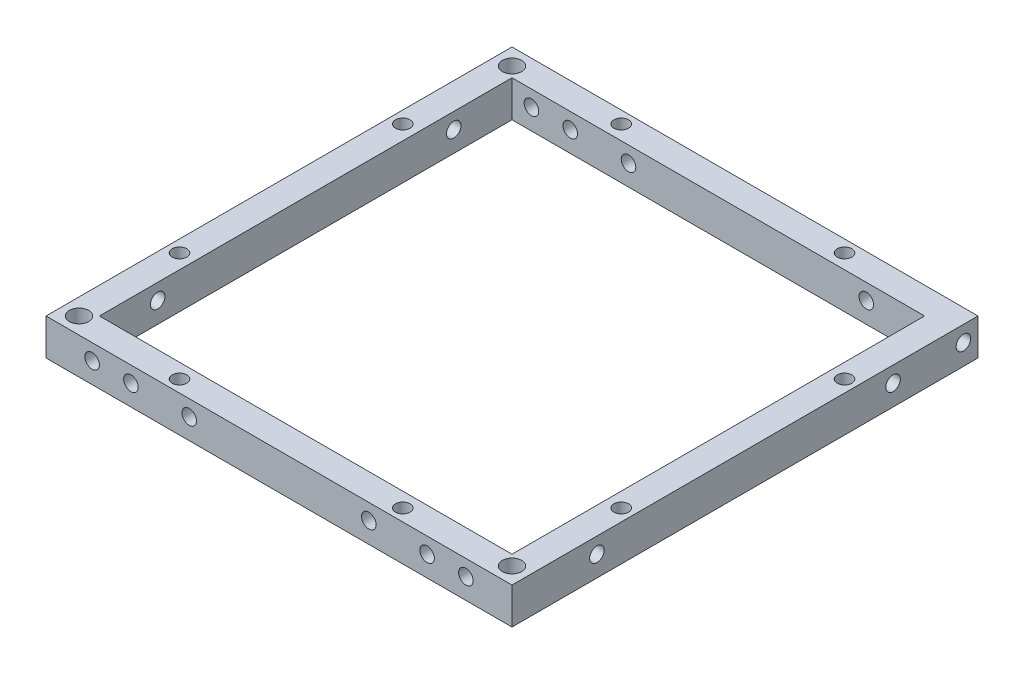
ISO-10303-21;
HEADER;
FILE_DESCRIPTION(('STEP AP214'),'2;1');
FILE_NAME('part.step','',(''),(''),'','','');
FILE_SCHEMA(('AUTOMOTIVE_DESIGN { 1 0 10303 214 1 1 1 1 }'));
ENDSEC;
DATA;
#1=APPLICATION_CONTEXT('core data for automotive mechanical design processes');
#2=APPLICATION_PROTOCOL_DEFINITION('international standard','automotive_design',2000,#1);
#3=PRODUCT_CONTEXT('',#1,'mechanical');
#4=PRODUCT('Part','Part','',(#3));
#5=PRODUCT_RELATED_PRODUCT_CATEGORY('part','',(#4));
#6=PRODUCT_DEFINITION_FORMATION('','',#4);
#7=PRODUCT_DEFINITION_CONTEXT('part definition',#1,'design');
#8=PRODUCT_DEFINITION('design','',#6,#7);
#9=PRODUCT_DEFINITION_SHAPE('','',#8);
#10=(LENGTH_UNIT() NAMED_UNIT(*) SI_UNIT(.MILLI.,.METRE.));
#11=(NAMED_UNIT(*) PLANE_ANGLE_UNIT() SI_UNIT($,.RADIAN.));
#12=(NAMED_UNIT(*) SI_UNIT($,.STERADIAN.) SOLID_ANGLE_UNIT());
#13=UNCERTAINTY_MEASURE_WITH_UNIT(LENGTH_MEASURE(1.E-05),#10,'distance_accuracy_value','');
#14=(GEOMETRIC_REPRESENTATION_CONTEXT(3) GLOBAL_UNCERTAINTY_ASSIGNED_CONTEXT((#13)) GLOBAL_UNIT_ASSIGNED_CONTEXT((#10,
#11,#12)) REPRESENTATION_CONTEXT('',''));
#15=CARTESIAN_POINT('',(0.,0.,0.));
#16=DIRECTION('',(0.,0.,1.));
#17=DIRECTION('',(1.,0.,0.));
#18=AXIS2_PLACEMENT_3D('',#15,#16,#17);
#19=CARTESIAN_POINT('',(0.,6.5,0.));
#20=DIRECTION('',(0.,1.,0.));
#21=DIRECTION('',(0.,0.,1.));
#22=AXIS2_PLACEMENT_3D('',#19,#20,#21);
#23=PLANE('',#22);
#24=DIRECTION('',(1.,0.,0.));
#25=VECTOR('',#24,1.);
#26=CARTESIAN_POINT('',(-98.,6.5,48.));
#27=LINE('',#26,#25);
#28=CARTESIAN_POINT('',(-48.,6.5,48.));
#29=VERTEX_POINT('',#28);
#30=CARTESIAN_POINT('',(48.,6.5,48.));
#31=VERTEX_POINT('',#30);
#32=EDGE_CURVE('E79',#29,#31,#27,.T.);
#33=ORIENTED_EDGE('',*,*,#32,.T.);
#34=DIRECTION('',(0.,0.,-1.));
#35=VECTOR('',#34,1.);
#36=CARTESIAN_POINT('',(48.,6.5,48.));
#37=LINE('',#36,#35);
#38=CARTESIAN_POINT('',(48.,6.5,-48.));
#39=VERTEX_POINT('',#38);
#40=EDGE_CURVE('E261',#31,#39,#37,.T.);
#41=ORIENTED_EDGE('',*,*,#40,.T.);
#42=DIRECTION('',(1.,0.,0.));
#43=VECTOR('',#42,1.);
#44=CARTESIAN_POINT('',(-98.,6.5,-48.));
#45=LINE('',#44,#43);
#46=CARTESIAN_POINT('',(-48.,6.5,-48.));
#47=VERTEX_POINT('',#46);
#48=EDGE_CURVE('E235',#47,#39,#45,.T.);
#49=ORIENTED_EDGE('',*,*,#48,.F.);
#50=DIRECTION('',(0.,0.,-1.));
#51=VECTOR('',#50,1.);
#52=CARTESIAN_POINT('',(-48.,6.5,48.));
#53=LINE('',#52,#51);
#54=EDGE_CURVE('E71',#29,#47,#53,.T.);
#55=ORIENTED_EDGE('',*,*,#54,.F.);
#56=EDGE_LOOP('',(#33,#41,#49,#55));
#57=FACE_BOUND('',#56,.T.);
#58=CARTESIAN_POINT('',(-45.4999999999994,6.5,-22.9999999999997));
#59=DIRECTION('',(0.,-1.,0.));
#60=DIRECTION('',(0.,0.,-1.));
#61=AXIS2_PLACEMENT_3D('',#58,#59,#60);
#62=CIRCLE('',#61,1.5);
#63=CARTESIAN_POINT('',(-45.4999999999994,6.5,-24.4999999999997));
#64=VERTEX_POINT('',#63);
#65=EDGE_CURVE('E264',#64,#64,#62,.F.);
#66=ORIENTED_EDGE('',*,*,#65,.F.);
#67=EDGE_LOOP('',(#66));
#68=FACE_BOUND('',#67,.T.);
#69=CARTESIAN_POINT('',(23.0000000000005,6.5,-45.5));
#70=DIRECTION('',(0.,-1.,0.));
#71=DIRECTION('',(0.,0.,-1.));
#72=AXIS2_PLACEMENT_3D('',#69,#70,#71);
#73=CIRCLE('',#72,1.5);
#74=CARTESIAN_POINT('',(23.0000000000005,6.5,-47.));
#75=VERTEX_POINT('',#74);
#76=EDGE_CURVE('E270',#75,#75,#73,.F.);
#77=ORIENTED_EDGE('',*,*,#76,.F.);
#78=EDGE_LOOP('',(#77));
#79=FACE_BOUND('',#78,.T.);
#80=CARTESIAN_POINT('',(45.5000000000008,6.5,22.9999999999999));
#81=DIRECTION('',(0.,-1.,0.));
#82=DIRECTION('',(0.,0.,-1.));
#83=AXIS2_PLACEMENT_3D('',#80,#81,#82);
#84=CIRCLE('',#83,1.5);
#85=CARTESIAN_POINT('',(45.5000000000008,6.5,21.4999999999999));
#86=VERTEX_POINT('',#85);
#87=EDGE_CURVE('E276',#86,#86,#84,.F.);
#88=ORIENTED_EDGE('',*,*,#87,.F.);
#89=EDGE_LOOP('',(#88));
#90=FACE_BOUND('',#89,.T.);
#91=CARTESIAN_POINT('',(-22.9999999999991,6.5,45.5000000000002));
#92=DIRECTION('',(0.,-1.,0.));
#93=DIRECTION('',(0.,0.,-1.));
#94=AXIS2_PLACEMENT_3D('',#91,#92,#93);
#95=CIRCLE('',#94,1.5);
#96=CARTESIAN_POINT('',(-22.9999999999991,6.5,44.0000000000002));
#97=VERTEX_POINT('',#96);
#98=EDGE_CURVE('E254',#97,#97,#95,.F.);
#99=ORIENTED_EDGE('',*,*,#98,.F.);
#100=EDGE_LOOP('',(#99));
#101=FACE_BOUND('',#100,.T.);
#102=CARTESIAN_POINT('',(23.0000000000009,6.5,45.5));
#103=DIRECTION('',(0.,-1.,0.));
#104=DIRECTION('',(0.,0.,-1.));
#105=AXIS2_PLACEMENT_3D('',#102,#103,#104);
#106=CIRCLE('',#105,1.5);
#107=CARTESIAN_POINT('',(23.0000000000009,6.5,44.));
#108=VERTEX_POINT('',#107);
#109=EDGE_CURVE('E279',#108,#108,#106,.F.);
#110=ORIENTED_EDGE('',*,*,#109,.F.);
#111=EDGE_LOOP('',(#110));
#112=FACE_BOUND('',#111,.T.);
#113=CARTESIAN_POINT('',(45.5000000000006,6.5,-23.0000000000001));
#114=DIRECTION('',(0.,-1.,0.));
#115=DIRECTION('',(0.,0.,-1.));
#116=AXIS2_PLACEMENT_3D('',#113,#114,#115);
#117=CIRCLE('',#116,1.5);
#118=CARTESIAN_POINT('',(45.5000000000006,6.5,-24.5000000000001));
#119=VERTEX_POINT('',#118);
#120=EDGE_CURVE('E273',#119,#119,#117,.F.);
#121=ORIENTED_EDGE('',*,*,#120,.F.);
#122=EDGE_LOOP('',(#121));
#123=FACE_BOUND('',#122,.T.);
#124=CARTESIAN_POINT('',(-22.9999999999995,6.5,-45.4999999999998));
#125=DIRECTION('',(0.,-1.,0.));
#126=DIRECTION('',(0.,0.,-1.));
#127=AXIS2_PLACEMENT_3D('',#124,#125,#126);
#128=CIRCLE('',#127,1.5);
#129=CARTESIAN_POINT('',(-22.9999999999995,6.5,-46.9999999999998));
#130=VERTEX_POINT('',#129);
#131=EDGE_CURVE('E267',#130,#130,#128,.F.);
#132=ORIENTED_EDGE('',*,*,#131,.F.);
#133=EDGE_LOOP('',(#132));
#134=FACE_BOUND('',#133,.T.);
#135=CARTESIAN_POINT('',(-45.4999999999992,6.5,23.0000000000003));
#136=DIRECTION('',(0.,-1.,0.));
#137=DIRECTION('',(0.,0.,-1.));
#138=AXIS2_PLACEMENT_3D('',#135,#136,#137);
#139=CIRCLE('',#138,1.5);
#140=CARTESIAN_POINT('',(-45.4999999999992,6.5,21.5000000000003));
#141=VERTEX_POINT('',#140);
#142=EDGE_CURVE('E247',#141,#141,#139,.F.);
#143=ORIENTED_EDGE('',*,*,#142,.F.);
#144=EDGE_LOOP('',(#143));
#145=FACE_BOUND('',#144,.T.);
#146=CARTESIAN_POINT('',(-44.6,6.5,-44.6));
#147=DIRECTION('',(0.,1.,0.));
#148=DIRECTION('',(0.,0.,1.));
#149=AXIS2_PLACEMENT_3D('',#146,#147,#148);
#150=CIRCLE('',#149,1.99999999999999);
#151=CARTESIAN_POINT('',(-44.6,6.5,-42.6));
#152=VERTEX_POINT('',#151);
#153=EDGE_CURVE('E259',#152,#152,#150,.T.);
#154=ORIENTED_EDGE('',*,*,#153,.F.);
#155=EDGE_LOOP('',(#154));
#156=FACE_BOUND('',#155,.T.);
#157=CARTESIAN_POINT('',(-44.6,6.5,44.6));
#158=DIRECTION('',(0.,1.,0.));
#159=DIRECTION('',(0.,0.,1.));
#160=AXIS2_PLACEMENT_3D('',#157,#158,#159);
#161=CIRCLE('',#160,1.99999999999999);
#162=CARTESIAN_POINT('',(-44.6,6.5,46.6));
#163=VERTEX_POINT('',#162);
#164=EDGE_CURVE('E290',#163,#163,#161,.T.);
#165=ORIENTED_EDGE('',*,*,#164,.F.);
#166=EDGE_LOOP('',(#165));
#167=FACE_BOUND('',#166,.T.);
#168=CARTESIAN_POINT('',(44.6000000000008,6.5,44.600000000002));
#169=DIRECTION('',(0.,1.,0.));
#170=DIRECTION('',(0.,0.,1.));
#171=AXIS2_PLACEMENT_3D('',#168,#169,#170);
#172=CIRCLE('',#171,1.99999999999999);
#173=CARTESIAN_POINT('',(44.6000000000008,6.5,46.600000000002));
#174=VERTEX_POINT('',#173);
#175=EDGE_CURVE('E293',#174,#174,#172,.T.);
#176=ORIENTED_EDGE('',*,*,#175,.F.);
#177=EDGE_LOOP('',(#176));
#178=FACE_BOUND('',#177,.T.);
#179=DIRECTION('',(0.,0.,-1.));
#180=VECTOR('',#179,1.);
#181=CARTESIAN_POINT('',(-42.5,6.5,-40.5));
#182=LINE('',#181,#180);
#183=CARTESIAN_POINT('',(-42.5,6.50000000000001,42.5));
#184=VERTEX_POINT('',#183);
#185=CARTESIAN_POINT('',(-42.5,6.50000000000001,-42.5));
#186=VERTEX_POINT('',#185);
#187=EDGE_CURVE('E13',#184,#186,#182,.T.);
#188=ORIENTED_EDGE('',*,*,#187,.T.);
#189=DIRECTION('',(-1.,0.,0.));
#190=VECTOR('',#189,1.);
#191=CARTESIAN_POINT('',(35.0000000000001,6.5,-42.5));
#192=LINE('',#191,#190);
#193=CARTESIAN_POINT('',(42.5000000000001,6.5,-42.5));
#194=VERTEX_POINT('',#193);
#195=EDGE_CURVE('E117',#194,#186,#192,.T.);
#196=ORIENTED_EDGE('',*,*,#195,.F.);
#197=DIRECTION('',(0.,0.,1.));
#198=VECTOR('',#197,1.);
#199=CARTESIAN_POINT('',(42.5,6.5,40.5));
#200=LINE('',#199,#198);
#201=CARTESIAN_POINT('',(42.5000000000001,6.50000000000001,42.5));
#202=VERTEX_POINT('',#201);
#203=EDGE_CURVE('E55',#194,#202,#200,.T.);
#204=ORIENTED_EDGE('',*,*,#203,.T.);
#205=DIRECTION('',(1.,0.,0.));
#206=VECTOR('',#205,1.);
#207=CARTESIAN_POINT('',(35.0000000000001,6.5,42.5));
#208=LINE('',#207,#206);
#209=EDGE_CURVE('E128',#184,#202,#208,.T.);
#210=ORIENTED_EDGE('',*,*,#209,.F.);
#211=EDGE_LOOP('',(#188,#196,#204,#210));
#212=FACE_BOUND('',#211,.T.);
#213=ADVANCED_FACE('F48',(#57,#68,#79,#90,#101,#112,#123,#134,#145,#156,#167,#178,#212),#23,.T.);
#214=CARTESIAN_POINT('',(30.500000000001,3.24999999999945,48.));
#215=DIRECTION('',(0.,0.,1.));
#216=DIRECTION('',(1.,0.,0.));
#217=AXIS2_PLACEMENT_3D('',#214,#215,#216);
#218=CYLINDRICAL_SURFACE('',#217,1.49999999999998);
#219=CARTESIAN_POINT('',(30.500000000001,3.24999999999945,48.));
#220=DIRECTION('',(0.,0.,1.));
#221=DIRECTION('',(1.,0.,0.));
#222=AXIS2_PLACEMENT_3D('',#219,#220,#221);
#223=CIRCLE('',#222,1.49999999999999);
#224=CARTESIAN_POINT('',(32.000000000001,3.24999999999945,48.));
#225=VERTEX_POINT('',#224);
#226=EDGE_CURVE('E234',#225,#225,#223,.T.);
#227=ORIENTED_EDGE('',*,*,#226,.T.);
#228=EDGE_LOOP('',(#227));
#229=FACE_BOUND('',#228,.T.);
#230=CARTESIAN_POINT('',(30.500000000001,3.24999999999945,42.5));
#231=DIRECTION('',(0.,0.,-1.));
#232=DIRECTION('',(-1.,0.,0.));
#233=AXIS2_PLACEMENT_3D('',#230,#231,#232);
#234=CIRCLE('',#233,1.49999999999998);
#235=CARTESIAN_POINT('',(29.0000000000011,3.24999999999945,42.5));
#236=VERTEX_POINT('',#235);
#237=EDGE_CURVE('E139',#236,#236,#234,.F.);
#238=ORIENTED_EDGE('',*,*,#237,.F.);
#239=EDGE_LOOP('',(#238));
#240=FACE_BOUND('',#239,.T.);
#241=ADVANCED_FACE('F354',(#229,#240),#218,.F.);
#242=CARTESIAN_POINT('',(-30.499999999999,3.24999999999948,48.));
#243=DIRECTION('',(0.,0.,1.));
#244=DIRECTION('',(1.,0.,0.));
#245=AXIS2_PLACEMENT_3D('',#242,#243,#244);
#246=CYLINDRICAL_SURFACE('',#245,1.49999999999998);
#247=CARTESIAN_POINT('',(-30.499999999999,3.24999999999948,48.));
#248=DIRECTION('',(0.,0.,1.));
#249=DIRECTION('',(1.,0.,0.));
#250=AXIS2_PLACEMENT_3D('',#247,#248,#249);
#251=CIRCLE('',#250,1.49999999999999);
#252=CARTESIAN_POINT('',(-28.999999999999,3.24999999999948,48.));
#253=VERTEX_POINT('',#252);
#254=EDGE_CURVE('E242',#253,#253,#251,.T.);
#255=ORIENTED_EDGE('',*,*,#254,.T.);
#256=EDGE_LOOP('',(#255));
#257=FACE_BOUND('',#256,.T.);
#258=CARTESIAN_POINT('',(-30.499999999999,3.24999999999948,42.5));
#259=DIRECTION('',(0.,0.,-1.));
#260=DIRECTION('',(-1.,0.,0.));
#261=AXIS2_PLACEMENT_3D('',#258,#259,#260);
#262=CIRCLE('',#261,1.49999999999998);
#263=CARTESIAN_POINT('',(-31.999999999999,3.24999999999948,42.5));
#264=VERTEX_POINT('',#263);
#265=EDGE_CURVE('E135',#264,#264,#262,.F.);
#266=ORIENTED_EDGE('',*,*,#265,.F.);
#267=EDGE_LOOP('',(#266));
#268=FACE_BOUND('',#267,.T.);
#269=ADVANCED_FACE('F479',(#257,#268),#246,.F.);
#270=CARTESIAN_POINT('',(-30.499999999999,3.24999999999948,-48.));
#271=DIRECTION('',(0.,0.,1.));
#272=DIRECTION('',(1.,0.,0.));
#273=AXIS2_PLACEMENT_3D('',#270,#271,#272);
#274=CIRCLE('',#273,1.49999999999998);
#275=CARTESIAN_POINT('',(-28.999999999999,3.24999999999948,-48.));
#276=VERTEX_POINT('',#275);
#277=EDGE_CURVE('E230',#276,#276,#274,.T.);
#278=ORIENTED_EDGE('',*,*,#277,.F.);
#279=EDGE_LOOP('',(#278));
#280=FACE_BOUND('',#279,.T.);
#281=CARTESIAN_POINT('',(-30.499999999999,3.24999999999948,-42.5));
#282=DIRECTION('',(0.,0.,1.));
#283=DIRECTION('',(1.,0.,0.));
#284=AXIS2_PLACEMENT_3D('',#281,#282,#283);
#285=CIRCLE('',#284,1.49999999999998);
#286=CARTESIAN_POINT('',(-28.999999999999,3.24999999999948,-42.5));
#287=VERTEX_POINT('',#286);
#288=EDGE_CURVE('E147',#287,#287,#285,.F.);
#289=ORIENTED_EDGE('',*,*,#288,.F.);
#290=EDGE_LOOP('',(#289));
#291=FACE_BOUND('',#290,.T.);
#292=ADVANCED_FACE('F410',(#280,#291),#246,.F.);
#293=CARTESIAN_POINT('',(0.,-1.,0.));
#294=DIRECTION('',(0.,-1.,0.));
#295=DIRECTION('',(0.,0.,-1.));
#296=AXIS2_PLACEMENT_3D('',#293,#294,#295);
#297=PLANE('',#296);
#298=CARTESIAN_POINT('',(-44.6,-1.,44.6));
#299=DIRECTION('',(0.,-1.,0.));
#300=DIRECTION('',(0.,0.,-1.));
#301=AXIS2_PLACEMENT_3D('',#298,#299,#300);
#302=CIRCLE('',#301,2.);
#303=CARTESIAN_POINT('',(-44.6,-1.,42.6));
#304=VERTEX_POINT('',#303);
#305=EDGE_CURVE('E150',#304,#304,#302,.T.);
#306=ORIENTED_EDGE('',*,*,#305,.F.);
#307=EDGE_LOOP('',(#306));
#308=FACE_BOUND('',#307,.T.);
#309=CARTESIAN_POINT('',(-44.6,-1.,-44.6));
#310=DIRECTION('',(0.,-1.,0.));
#311=DIRECTION('',(0.,0.,-1.));
#312=AXIS2_PLACEMENT_3D('',#309,#310,#311);
#313=CIRCLE('',#312,2.);
#314=CARTESIAN_POINT('',(-44.6,-1.,-46.6));
#315=VERTEX_POINT('',#314);
#316=EDGE_CURVE('E156',#315,#315,#313,.T.);
#317=ORIENTED_EDGE('',*,*,#316,.F.);
#318=EDGE_LOOP('',(#317));
#319=FACE_BOUND('',#318,.T.);
#320=CARTESIAN_POINT('',(23.0000000000009,-1.,45.5));
#321=DIRECTION('',(0.,-1.,0.));
#322=DIRECTION('',(0.,0.,-1.));
#323=AXIS2_PLACEMENT_3D('',#320,#321,#322);
#324=CIRCLE('',#323,1.5);
#325=CARTESIAN_POINT('',(23.0000000000009,-1.,44.));
#326=VERTEX_POINT('',#325);
#327=EDGE_CURVE('E162',#326,#326,#324,.T.);
#328=ORIENTED_EDGE('',*,*,#327,.F.);
#329=EDGE_LOOP('',(#328));
#330=FACE_BOUND('',#329,.T.);
#331=CARTESIAN_POINT('',(-45.4999999999992,-1.,23.0000000000003));
#332=DIRECTION('',(0.,-1.,0.));
#333=DIRECTION('',(0.,0.,-1.));
#334=AXIS2_PLACEMENT_3D('',#331,#332,#333);
#335=CIRCLE('',#334,1.50000000000002);
#336=CARTESIAN_POINT('',(-45.4999999999992,-1.,21.5000000000003));
#337=VERTEX_POINT('',#336);
#338=EDGE_CURVE('E168',#337,#337,#335,.T.);
#339=ORIENTED_EDGE('',*,*,#338,.F.);
#340=EDGE_LOOP('',(#339));
#341=FACE_BOUND('',#340,.T.);
#342=CARTESIAN_POINT('',(44.6000000000008,-1.,44.600000000002));
#343=DIRECTION('',(0.,-1.,0.));
#344=DIRECTION('',(0.,0.,-1.));
#345=AXIS2_PLACEMENT_3D('',#342,#343,#344);
#346=CIRCLE('',#345,2.);
#347=CARTESIAN_POINT('',(44.6000000000008,-1.,42.600000000002));
#348=VERTEX_POINT('',#347);
#349=EDGE_CURVE('E174',#348,#348,#346,.T.);
#350=ORIENTED_EDGE('',*,*,#349,.F.);
#351=EDGE_LOOP('',(#350));
#352=FACE_BOUND('',#351,.T.);
#353=CARTESIAN_POINT('',(23.0000000000005,-1.,-45.5));
#354=DIRECTION('',(0.,-1.,0.));
#355=DIRECTION('',(0.,0.,-1.));
#356=AXIS2_PLACEMENT_3D('',#353,#354,#355);
#357=CIRCLE('',#356,1.49999999999963);
#358=CARTESIAN_POINT('',(23.0000000000005,-1.,-46.9999999999996));
#359=VERTEX_POINT('',#358);
#360=EDGE_CURVE('E180',#359,#359,#357,.T.);
#361=ORIENTED_EDGE('',*,*,#360,.F.);
#362=EDGE_LOOP('',(#361));
#363=FACE_BOUND('',#362,.T.);
#364=DIRECTION('',(0.,0.,-1.));
#365=VECTOR('',#364,1.);
#366=CARTESIAN_POINT('',(-48.,-1.,48.));
#367=LINE('',#366,#365);
#368=CARTESIAN_POINT('',(-48.,-1.,48.));
#369=VERTEX_POINT('',#368);
#370=CARTESIAN_POINT('',(-48.,-1.,-48.));
#371=VERTEX_POINT('',#370);
#372=EDGE_CURVE('E190',#369,#371,#367,.T.);
#373=ORIENTED_EDGE('',*,*,#372,.T.);
#374=DIRECTION('',(1.,0.,0.));
#375=VECTOR('',#374,1.);
#376=CARTESIAN_POINT('',(-48.,-1.,-48.));
#377=LINE('',#376,#375);
#378=CARTESIAN_POINT('',(48.,-1.,-48.));
#379=VERTEX_POINT('',#378);
#380=EDGE_CURVE('E193',#371,#379,#377,.T.);
#381=ORIENTED_EDGE('',*,*,#380,.T.);
#382=DIRECTION('',(0.,0.,1.));
#383=VECTOR('',#382,1.);
#384=CARTESIAN_POINT('',(48.,-1.,48.));
#385=LINE('',#384,#383);
#386=CARTESIAN_POINT('',(48.,-1.,48.));
#387=VERTEX_POINT('',#386);
#388=EDGE_CURVE('E196',#379,#387,#385,.T.);
#389=ORIENTED_EDGE('',*,*,#388,.T.);
#390=DIRECTION('',(-1.,0.,0.));
#391=VECTOR('',#390,1.);
#392=CARTESIAN_POINT('',(-48.,-1.,48.));
#393=LINE('',#392,#391);
#394=EDGE_CURVE('E199',#387,#369,#393,.T.);
#395=ORIENTED_EDGE('',*,*,#394,.T.);
#396=EDGE_LOOP('',(#373,#381,#389,#395));
#397=FACE_BOUND('',#396,.T.);
#398=CARTESIAN_POINT('',(-22.9999999999995,-1.,-45.4999999999998));
#399=DIRECTION('',(0.,-1.,0.));
#400=DIRECTION('',(0.,0.,-1.));
#401=AXIS2_PLACEMENT_3D('',#398,#399,#400);
#402=CIRCLE('',#401,1.5);
#403=CARTESIAN_POINT('',(-22.9999999999995,-1.,-46.9999999999998));
#404=VERTEX_POINT('',#403);
#405=EDGE_CURVE('E177',#404,#404,#402,.T.);
#406=ORIENTED_EDGE('',*,*,#405,.F.);
#407=EDGE_LOOP('',(#406));
#408=FACE_BOUND('',#407,.T.);
#409=CARTESIAN_POINT('',(-45.4999999999994,-1.,-22.9999999999997));
#410=DIRECTION('',(0.,-1.,0.));
#411=DIRECTION('',(0.,0.,-1.));
#412=AXIS2_PLACEMENT_3D('',#409,#410,#411);
#413=CIRCLE('',#412,1.5);
#414=CARTESIAN_POINT('',(-45.4999999999994,-1.,-24.4999999999997));
#415=VERTEX_POINT('',#414);
#416=EDGE_CURVE('E171',#415,#415,#413,.T.);
#417=ORIENTED_EDGE('',*,*,#416,.F.);
#418=EDGE_LOOP('',(#417));
#419=FACE_BOUND('',#418,.T.);
#420=CARTESIAN_POINT('',(-22.9999999999991,-1.,45.5000000000002));
#421=DIRECTION('',(0.,-1.,0.));
#422=DIRECTION('',(0.,0.,-1.));
#423=AXIS2_PLACEMENT_3D('',#420,#421,#422);
#424=CIRCLE('',#423,1.5);
#425=CARTESIAN_POINT('',(-22.9999999999991,-1.,44.0000000000002));
#426=VERTEX_POINT('',#425);
#427=EDGE_CURVE('E165',#426,#426,#424,.T.);
#428=ORIENTED_EDGE('',*,*,#427,.F.);
#429=EDGE_LOOP('',(#428));
#430=FACE_BOUND('',#429,.T.);
#431=CARTESIAN_POINT('',(45.5000000000008,-1.,22.9999999999999));
#432=DIRECTION('',(0.,-1.,0.));
#433=DIRECTION('',(0.,0.,-1.));
#434=AXIS2_PLACEMENT_3D('',#431,#432,#433);
#435=CIRCLE('',#434,1.5);
#436=CARTESIAN_POINT('',(45.5000000000008,-1.,21.4999999999999));
#437=VERTEX_POINT('',#436);
#438=EDGE_CURVE('E159',#437,#437,#435,.T.);
#439=ORIENTED_EDGE('',*,*,#438,.F.);
#440=EDGE_LOOP('',(#439));
#441=FACE_BOUND('',#440,.T.);
#442=CARTESIAN_POINT('',(45.5000000000006,-1.,-23.0000000000001));
#443=DIRECTION('',(0.,-1.,0.));
#444=DIRECTION('',(0.,0.,-1.));
#445=AXIS2_PLACEMENT_3D('',#442,#443,#444);
#446=CIRCLE('',#445,1.5);
#447=CARTESIAN_POINT('',(45.5000000000006,-1.,-24.5000000000001));
#448=VERTEX_POINT('',#447);
#449=EDGE_CURVE('E153',#448,#448,#446,.T.);
#450=ORIENTED_EDGE('',*,*,#449,.F.);
#451=EDGE_LOOP('',(#450));
#452=FACE_BOUND('',#451,.T.);
#453=DIRECTION('',(1.,0.,0.));
#454=VECTOR('',#453,1.);
#455=CARTESIAN_POINT('',(42.5000000000001,-1.,-42.5));
#456=LINE('',#455,#454);
#457=CARTESIAN_POINT('',(-42.5,-0.999999999999987,-42.5));
#458=VERTEX_POINT('',#457);
#459=CARTESIAN_POINT('',(42.5000000000001,-1.,-42.5));
#460=VERTEX_POINT('',#459);
#461=EDGE_CURVE('E188',#458,#460,#456,.T.);
#462=ORIENTED_EDGE('',*,*,#461,.F.);
#463=DIRECTION('',(0.,0.,-1.));
#464=VECTOR('',#463,1.);
#465=CARTESIAN_POINT('',(-42.5,-1.,-40.5));
#466=LINE('',#465,#464);
#467=CARTESIAN_POINT('',(-42.5,-0.999999999999987,42.5));
#468=VERTEX_POINT('',#467);
#469=EDGE_CURVE('E134',#468,#458,#466,.T.);
#470=ORIENTED_EDGE('',*,*,#469,.F.);
#471=DIRECTION('',(-1.,0.,0.));
#472=VECTOR('',#471,1.);
#473=CARTESIAN_POINT('',(35.0000000000001,-1.,42.5));
#474=LINE('',#473,#472);
#475=CARTESIAN_POINT('',(42.5000000000001,-1.,42.5));
#476=VERTEX_POINT('',#475);
#477=EDGE_CURVE('E184',#476,#468,#474,.T.);
#478=ORIENTED_EDGE('',*,*,#477,.F.);
#479=DIRECTION('',(0.,0.,1.));
#480=VECTOR('',#479,1.);
#481=CARTESIAN_POINT('',(42.5000000000001,-1.,-42.5));
#482=LINE('',#481,#480);
#483=EDGE_CURVE('E62',#460,#476,#482,.T.);
#484=ORIENTED_EDGE('',*,*,#483,.F.);
#485=EDGE_LOOP('',(#462,#470,#478,#484));
#486=FACE_BOUND('',#485,.T.);
#487=ADVANCED_FACE('F373',(#308,#319,#330,#341,#352,#363,#397,#408,#419,#430,#441,#452,#486),
#297,.T.);
#488=CARTESIAN_POINT('',(35.0000000000001,-3.5,42.5));
#489=DIRECTION('',(0.,0.,1.));
#490=DIRECTION('',(1.,0.,0.));
#491=AXIS2_PLACEMENT_3D('',#488,#489,#490);
#492=PLANE('',#491);
#493=CARTESIAN_POINT('',(-38.5,3.24999999999948,42.5));
#494=DIRECTION('',(0.,0.,-1.));
#495=DIRECTION('',(-1.,0.,0.));
#496=AXIS2_PLACEMENT_3D('',#493,#494,#495);
#497=CIRCLE('',#496,1.49999999999999);
#498=CARTESIAN_POINT('',(-40.,3.24999999999948,42.5));
#499=VERTEX_POINT('',#498);
#500=EDGE_CURVE('E322',#499,#499,#497,.T.);
#501=ORIENTED_EDGE('',*,*,#500,.F.);
#502=EDGE_LOOP('',(#501));
#503=FACE_BOUND('',#502,.T.);
#504=CARTESIAN_POINT('',(-18.5,3.24999999999948,42.5));
#505=DIRECTION('',(0.,0.,-1.));
#506=DIRECTION('',(-1.,0.,0.));
#507=AXIS2_PLACEMENT_3D('',#504,#505,#506);
#508=CIRCLE('',#507,1.49999999999999);
#509=CARTESIAN_POINT('',(-20.,3.24999999999948,42.5));
#510=VERTEX_POINT('',#509);
#511=EDGE_CURVE('E316',#510,#510,#508,.T.);
#512=ORIENTED_EDGE('',*,*,#511,.F.);
#513=EDGE_LOOP('',(#512));
#514=FACE_BOUND('',#513,.T.);
#515=CARTESIAN_POINT('',(18.5,3.24999999999948,42.5));
#516=DIRECTION('',(0.,0.,-1.));
#517=DIRECTION('',(-1.,0.,0.));
#518=AXIS2_PLACEMENT_3D('',#515,#516,#517);
#519=CIRCLE('',#518,1.49999999999999);
#520=CARTESIAN_POINT('',(17.0000000000001,3.24999999999948,42.5));
#521=VERTEX_POINT('',#520);
#522=EDGE_CURVE('E310',#521,#521,#519,.T.);
#523=ORIENTED_EDGE('',*,*,#522,.F.);
#524=EDGE_LOOP('',(#523));
#525=FACE_BOUND('',#524,.T.);
#526=CARTESIAN_POINT('',(38.5000000000001,3.24999999999948,42.5));
#527=DIRECTION('',(0.,0.,-1.));
#528=DIRECTION('',(-1.,0.,0.));
#529=AXIS2_PLACEMENT_3D('',#526,#527,#528);
#530=CIRCLE('',#529,1.49999999999999);
#531=CARTESIAN_POINT('',(37.0000000000001,3.24999999999948,42.5));
#532=VERTEX_POINT('',#531);
#533=EDGE_CURVE('E302',#532,#532,#530,.T.);
#534=ORIENTED_EDGE('',*,*,#533,.F.);
#535=EDGE_LOOP('',(#534));
#536=FACE_BOUND('',#535,.T.);
#537=ORIENTED_EDGE('',*,*,#477,.T.);
#538=DIRECTION('',(0.,-1.,0.));
#539=VECTOR('',#538,1.);
#540=CARTESIAN_POINT('',(-42.5,51.5,42.5));
#541=LINE('',#540,#539);
#542=EDGE_CURVE('E136',#184,#468,#541,.T.);
#543=ORIENTED_EDGE('',*,*,#542,.F.);
#544=ORIENTED_EDGE('',*,*,#209,.T.);
#545=DIRECTION('',(0.,-1.,0.));
#546=VECTOR('',#545,1.);
#547=CARTESIAN_POINT('',(42.5000000000001,51.5,42.5));
#548=LINE('',#547,#546);
#549=EDGE_CURVE('E141',#202,#476,#548,.T.);
#550=ORIENTED_EDGE('',*,*,#549,.T.);
#551=EDGE_LOOP('',(#537,#543,#544,#550));
#552=FACE_BOUND('',#551,.T.);
#553=ORIENTED_EDGE('',*,*,#265,.T.);
#554=EDGE_LOOP('',(#553));
#555=FACE_BOUND('',#554,.T.);
#556=ORIENTED_EDGE('',*,*,#237,.T.);
#557=EDGE_LOOP('',(#556));
#558=FACE_BOUND('',#557,.T.);
#559=ADVANCED_FACE('F297',(#503,#514,#525,#536,#552,#555,#558),#492,.F.);
#560=CARTESIAN_POINT('',(35.0000000000001,-3.5,-42.5));
#561=DIRECTION('',(0.,0.,-1.));
#562=DIRECTION('',(-1.,0.,0.));
#563=AXIS2_PLACEMENT_3D('',#560,#561,#562);
#564=PLANE('',#563);
#565=CARTESIAN_POINT('',(-38.5,3.24999999999946,-42.5));
#566=DIRECTION('',(0.,0.,1.));
#567=DIRECTION('',(1.,0.,0.));
#568=AXIS2_PLACEMENT_3D('',#565,#566,#567);
#569=CIRCLE('',#568,1.49999999999999);
#570=CARTESIAN_POINT('',(-37.,3.24999999999946,-42.5));
#571=VERTEX_POINT('',#570);
#572=EDGE_CURVE('E334',#571,#571,#569,.T.);
#573=ORIENTED_EDGE('',*,*,#572,.F.);
#574=EDGE_LOOP('',(#573));
#575=FACE_BOUND('',#574,.T.);
#576=CARTESIAN_POINT('',(-18.5,3.24999999999946,-42.5));
#577=DIRECTION('',(0.,0.,1.));
#578=DIRECTION('',(1.,0.,0.));
#579=AXIS2_PLACEMENT_3D('',#576,#577,#578);
#580=CIRCLE('',#579,1.49999999999999);
#581=CARTESIAN_POINT('',(-17.,3.24999999999946,-42.5));
#582=VERTEX_POINT('',#581);
#583=EDGE_CURVE('E328',#582,#582,#580,.T.);
#584=ORIENTED_EDGE('',*,*,#583,.F.);
#585=EDGE_LOOP('',(#584));
#586=FACE_BOUND('',#585,.T.);
#587=CARTESIAN_POINT('',(30.500000000001,3.24999999999945,-42.5));
#588=DIRECTION('',(0.,0.,-1.));
#589=DIRECTION('',(-1.,0.,0.));
#590=AXIS2_PLACEMENT_3D('',#587,#588,#589);
#591=CIRCLE('',#590,1.49999999999998);
#592=CARTESIAN_POINT('',(29.0000000000011,3.24999999999945,-42.5));
#593=VERTEX_POINT('',#592);
#594=EDGE_CURVE('E124',#593,#593,#591,.F.);
#595=ORIENTED_EDGE('',*,*,#594,.F.);
#596=EDGE_LOOP('',(#595));
#597=FACE_BOUND('',#596,.T.);
#598=ORIENTED_EDGE('',*,*,#195,.T.);
#599=DIRECTION('',(0.,-1.,0.));
#600=VECTOR('',#599,1.);
#601=CARTESIAN_POINT('',(-42.5,51.5,-42.5));
#602=LINE('',#601,#600);
#603=EDGE_CURVE('E121',#186,#458,#602,.T.);
#604=ORIENTED_EDGE('',*,*,#603,.T.);
#605=ORIENTED_EDGE('',*,*,#461,.T.);
#606=DIRECTION('',(0.,-1.,0.));
#607=VECTOR('',#606,1.);
#608=CARTESIAN_POINT('',(42.5000000000001,0.,-42.5));
#609=LINE('',#608,#607);
#610=EDGE_CURVE('E122',#194,#460,#609,.T.);
#611=ORIENTED_EDGE('',*,*,#610,.F.);
#612=EDGE_LOOP('',(#598,#604,#605,#611));
#613=FACE_BOUND('',#612,.T.);
#614=ORIENTED_EDGE('',*,*,#288,.T.);
#615=EDGE_LOOP('',(#614));
#616=FACE_BOUND('',#615,.T.);
#617=ADVANCED_FACE('F118',(#575,#586,#597,#613,#616),#564,.F.);
#618=CARTESIAN_POINT('',(-48.,8.,48.));
#619=DIRECTION('',(1.,0.,0.));
#620=DIRECTION('',(0.,0.,-1.));
#621=AXIS2_PLACEMENT_3D('',#618,#619,#620);
#622=PLANE('',#621);
#623=CARTESIAN_POINT('',(-48.,3.24999999999877,-30.4999999999993));
#624=DIRECTION('',(-1.,0.,0.));
#625=DIRECTION('',(0.,0.,1.));
#626=AXIS2_PLACEMENT_3D('',#623,#624,#625);
#627=CIRCLE('',#626,1.49999999999999);
#628=CARTESIAN_POINT('',(-48.,3.24999999999877,-28.9999999999994));
#629=VERTEX_POINT('',#628);
#630=EDGE_CURVE('E253',#629,#629,#627,.T.);
#631=ORIENTED_EDGE('',*,*,#630,.F.);
#632=EDGE_LOOP('',(#631));
#633=FACE_BOUND('',#632,.T.);
#634=CARTESIAN_POINT('',(-48.,3.24999999999877,30.5000000000007));
#635=DIRECTION('',(-1.,0.,0.));
#636=DIRECTION('',(0.,0.,1.));
#637=AXIS2_PLACEMENT_3D('',#634,#635,#636);
#638=CIRCLE('',#637,1.49999999999999);
#639=CARTESIAN_POINT('',(-48.,3.24999999999877,32.0000000000007));
#640=VERTEX_POINT('',#639);
#641=EDGE_CURVE('E250',#640,#640,#638,.T.);
#642=ORIENTED_EDGE('',*,*,#641,.F.);
#643=EDGE_LOOP('',(#642));
#644=FACE_BOUND('',#643,.T.);
#645=DIRECTION('',(0.,-1.,0.));
#646=VECTOR('',#645,1.);
#647=CARTESIAN_POINT('',(-48.,8.,48.));
#648=LINE('',#647,#646);
#649=EDGE_CURVE('E224',#29,#369,#648,.T.);
#650=ORIENTED_EDGE('',*,*,#649,.F.);
#651=ORIENTED_EDGE('',*,*,#54,.T.);
#652=DIRECTION('',(0.,-1.,0.));
#653=VECTOR('',#652,1.);
#654=CARTESIAN_POINT('',(-48.,8.,-48.));
#655=LINE('',#654,#653);
#656=EDGE_CURVE('E227',#47,#371,#655,.T.);
#657=ORIENTED_EDGE('',*,*,#656,.T.);
#658=ORIENTED_EDGE('',*,*,#372,.F.);
#659=EDGE_LOOP('',(#650,#651,#657,#658));
#660=FACE_BOUND('',#659,.T.);
#661=ADVANCED_FACE('F342',(#633,#644,#660),#622,.F.);
#662=CARTESIAN_POINT('',(48.,8.,48.));
#663=DIRECTION('',(0.,0.,-1.));
#664=DIRECTION('',(-1.,0.,0.));
#665=AXIS2_PLACEMENT_3D('',#662,#663,#664);
#666=PLANE('',#665);
#667=CARTESIAN_POINT('',(-38.5,3.24999999999948,48.));
#668=DIRECTION('',(0.,0.,-1.));
#669=DIRECTION('',(-1.,0.,0.));
#670=AXIS2_PLACEMENT_3D('',#667,#668,#669);
#671=CIRCLE('',#670,1.5);
#672=CARTESIAN_POINT('',(-40.,3.24999999999948,48.));
#673=VERTEX_POINT('',#672);
#674=EDGE_CURVE('E319',#673,#673,#671,.T.);
#675=ORIENTED_EDGE('',*,*,#674,.T.);
#676=EDGE_LOOP('',(#675));
#677=FACE_BOUND('',#676,.T.);
#678=CARTESIAN_POINT('',(-18.5,3.24999999999948,48.));
#679=DIRECTION('',(0.,0.,-1.));
#680=DIRECTION('',(-1.,0.,0.));
#681=AXIS2_PLACEMENT_3D('',#678,#679,#680);
#682=CIRCLE('',#681,1.5);
#683=CARTESIAN_POINT('',(-20.,3.24999999999948,48.));
#684=VERTEX_POINT('',#683);
#685=EDGE_CURVE('E313',#684,#684,#682,.T.);
#686=ORIENTED_EDGE('',*,*,#685,.T.);
#687=EDGE_LOOP('',(#686));
#688=FACE_BOUND('',#687,.T.);
#689=CARTESIAN_POINT('',(18.5,3.24999999999948,48.));
#690=DIRECTION('',(0.,0.,-1.));
#691=DIRECTION('',(-1.,0.,0.));
#692=AXIS2_PLACEMENT_3D('',#689,#690,#691);
#693=CIRCLE('',#692,1.5);
#694=CARTESIAN_POINT('',(17.0000000000001,3.24999999999948,48.));
#695=VERTEX_POINT('',#694);
#696=EDGE_CURVE('E307',#695,#695,#693,.T.);
#697=ORIENTED_EDGE('',*,*,#696,.T.);
#698=EDGE_LOOP('',(#697));
#699=FACE_BOUND('',#698,.T.);
#700=CARTESIAN_POINT('',(38.5000000000001,3.24999999999948,48.));
#701=DIRECTION('',(0.,0.,-1.));
#702=DIRECTION('',(-1.,0.,0.));
#703=AXIS2_PLACEMENT_3D('',#700,#701,#702);
#704=CIRCLE('',#703,1.5);
#705=CARTESIAN_POINT('',(37.0000000000001,3.24999999999948,48.));
#706=VERTEX_POINT('',#705);
#707=EDGE_CURVE('E300',#706,#706,#704,.T.);
#708=ORIENTED_EDGE('',*,*,#707,.T.);
#709=EDGE_LOOP('',(#708));
#710=FACE_BOUND('',#709,.T.);
#711=ORIENTED_EDGE('',*,*,#254,.F.);
#712=EDGE_LOOP('',(#711));
#713=FACE_BOUND('',#712,.T.);
#714=ORIENTED_EDGE('',*,*,#226,.F.);
#715=EDGE_LOOP('',(#714));
#716=FACE_BOUND('',#715,.T.);
#717=DIRECTION('',(0.,-1.,0.));
#718=VECTOR('',#717,1.);
#719=CARTESIAN_POINT('',(48.,8.,48.));
#720=LINE('',#719,#718);
#721=EDGE_CURVE('E228',#31,#387,#720,.T.);
#722=ORIENTED_EDGE('',*,*,#721,.F.);
#723=ORIENTED_EDGE('',*,*,#32,.F.);
#724=ORIENTED_EDGE('',*,*,#649,.T.);
#725=ORIENTED_EDGE('',*,*,#394,.F.);
#726=EDGE_LOOP('',(#722,#723,#724,#725));
#727=FACE_BOUND('',#726,.T.);
#728=ADVANCED_FACE('F371',(#677,#688,#699,#710,#713,#716,#727),#666,.F.);
#729=CARTESIAN_POINT('',(48.,8.,48.));
#730=DIRECTION('',(-1.,0.,0.));
#731=DIRECTION('',(0.,0.,1.));
#732=AXIS2_PLACEMENT_3D('',#729,#730,#731);
#733=PLANE('',#732);
#734=CARTESIAN_POINT('',(48.,3.25,-45.0000000000037));
#735=DIRECTION('',(1.,0.,0.));
#736=DIRECTION('',(0.,0.,-1.));
#737=AXIS2_PLACEMENT_3D('',#734,#735,#736);
#738=CIRCLE('',#737,1.5);
#739=CARTESIAN_POINT('',(48.,3.25,-46.5000000000037));
#740=VERTEX_POINT('',#739);
#741=EDGE_CURVE('E218',#740,#740,#738,.T.);
#742=ORIENTED_EDGE('',*,*,#741,.F.);
#743=EDGE_LOOP('',(#742));
#744=FACE_BOUND('',#743,.T.);
#745=CARTESIAN_POINT('',(48.,3.24999999999877,-30.4999999999993));
#746=DIRECTION('',(-1.,0.,0.));
#747=DIRECTION('',(0.,0.,1.));
#748=AXIS2_PLACEMENT_3D('',#745,#746,#747);
#749=CIRCLE('',#748,1.49999999999999);
#750=CARTESIAN_POINT('',(48.,3.24999999999877,-28.9999999999994));
#751=VERTEX_POINT('',#750);
#752=EDGE_CURVE('E226',#751,#751,#749,.T.);
#753=ORIENTED_EDGE('',*,*,#752,.T.);
#754=EDGE_LOOP('',(#753));
#755=FACE_BOUND('',#754,.T.);
#756=CARTESIAN_POINT('',(48.,3.24999999999877,30.5000000000007));
#757=DIRECTION('',(-1.,0.,0.));
#758=DIRECTION('',(0.,0.,1.));
#759=AXIS2_PLACEMENT_3D('',#756,#757,#758);
#760=CIRCLE('',#759,1.49999999999999);
#761=CARTESIAN_POINT('',(48.,3.24999999999877,32.0000000000007));
#762=VERTEX_POINT('',#761);
#763=EDGE_CURVE('E231',#762,#762,#760,.T.);
#764=ORIENTED_EDGE('',*,*,#763,.T.);
#765=EDGE_LOOP('',(#764));
#766=FACE_BOUND('',#765,.T.);
#767=DIRECTION('',(0.,-1.,0.));
#768=VECTOR('',#767,1.);
#769=CARTESIAN_POINT('',(48.,8.,-48.));
#770=LINE('',#769,#768);
#771=EDGE_CURVE('E232',#39,#379,#770,.T.);
#772=ORIENTED_EDGE('',*,*,#771,.F.);
#773=ORIENTED_EDGE('',*,*,#40,.F.);
#774=ORIENTED_EDGE('',*,*,#721,.T.);
#775=ORIENTED_EDGE('',*,*,#388,.F.);
#776=EDGE_LOOP('',(#772,#773,#774,#775));
#777=FACE_BOUND('',#776,.T.);
#778=ADVANCED_FACE('F359',(#744,#755,#766,#777),#733,.F.);
#779=CARTESIAN_POINT('',(48.,8.,-48.));
#780=DIRECTION('',(0.,0.,1.));
#781=DIRECTION('',(1.,0.,0.));
#782=AXIS2_PLACEMENT_3D('',#779,#780,#781);
#783=PLANE('',#782);
#784=CARTESIAN_POINT('',(-38.5,3.24999999999946,-48.));
#785=DIRECTION('',(0.,0.,1.));
#786=DIRECTION('',(1.,0.,0.));
#787=AXIS2_PLACEMENT_3D('',#784,#785,#786);
#788=CIRCLE('',#787,1.5);
#789=CARTESIAN_POINT('',(-37.,3.24999999999946,-48.));
#790=VERTEX_POINT('',#789);
#791=EDGE_CURVE('E331',#790,#790,#788,.T.);
#792=ORIENTED_EDGE('',*,*,#791,.T.);
#793=EDGE_LOOP('',(#792));
#794=FACE_BOUND('',#793,.T.);
#795=CARTESIAN_POINT('',(-18.5,3.24999999999946,-48.));
#796=DIRECTION('',(0.,0.,1.));
#797=DIRECTION('',(1.,0.,0.));
#798=AXIS2_PLACEMENT_3D('',#795,#796,#797);
#799=CIRCLE('',#798,1.5);
#800=CARTESIAN_POINT('',(-17.,3.24999999999946,-48.));
#801=VERTEX_POINT('',#800);
#802=EDGE_CURVE('E325',#801,#801,#799,.T.);
#803=ORIENTED_EDGE('',*,*,#802,.T.);
#804=EDGE_LOOP('',(#803));
#805=FACE_BOUND('',#804,.T.);
#806=ORIENTED_EDGE('',*,*,#277,.T.);
#807=EDGE_LOOP('',(#806));
#808=FACE_BOUND('',#807,.T.);
#809=CARTESIAN_POINT('',(30.500000000001,3.24999999999945,-48.));
#810=DIRECTION('',(0.,0.,1.));
#811=DIRECTION('',(1.,0.,0.));
#812=AXIS2_PLACEMENT_3D('',#809,#810,#811);
#813=CIRCLE('',#812,1.49999999999997);
#814=CARTESIAN_POINT('',(32.000000000001,3.24999999999945,-48.));
#815=VERTEX_POINT('',#814);
#816=EDGE_CURVE('E237',#815,#815,#813,.T.);
#817=ORIENTED_EDGE('',*,*,#816,.T.);
#818=EDGE_LOOP('',(#817));
#819=FACE_BOUND('',#818,.T.);
#820=ORIENTED_EDGE('',*,*,#656,.F.);
#821=ORIENTED_EDGE('',*,*,#48,.T.);
#822=ORIENTED_EDGE('',*,*,#771,.T.);
#823=ORIENTED_EDGE('',*,*,#380,.F.);
#824=EDGE_LOOP('',(#820,#821,#822,#823));
#825=FACE_BOUND('',#824,.T.);
#826=ADVANCED_FACE('F352',(#794,#805,#808,#819,#825),#783,.F.);
#827=ORIENTED_EDGE('',*,*,#594,.T.);
#828=EDGE_LOOP('',(#827));
#829=FACE_BOUND('',#828,.T.);
#830=ORIENTED_EDGE('',*,*,#816,.F.);
#831=EDGE_LOOP('',(#830));
#832=FACE_BOUND('',#831,.T.);
#833=ADVANCED_FACE('F348',(#829,#832),#218,.F.);
#834=CARTESIAN_POINT('',(-45.4999999999992,0.,23.0000000000003));
#835=DIRECTION('',(0.,-1.,0.));
#836=DIRECTION('',(0.,0.,-1.));
#837=AXIS2_PLACEMENT_3D('',#834,#835,#836);
#838=CYLINDRICAL_SURFACE('',#837,1.5);
#839=ORIENTED_EDGE('',*,*,#142,.T.);
#840=EDGE_LOOP('',(#839));
#841=FACE_BOUND('',#840,.T.);
#842=ORIENTED_EDGE('',*,*,#338,.T.);
#843=EDGE_LOOP('',(#842));
#844=FACE_BOUND('',#843,.T.);
#845=ADVANCED_FACE('F351',(#841,#844),#838,.F.);
#846=CARTESIAN_POINT('',(-45.4999999999994,0.,-22.9999999999997));
#847=DIRECTION('',(0.,-1.,0.));
#848=DIRECTION('',(0.,0.,-1.));
#849=AXIS2_PLACEMENT_3D('',#846,#847,#848);
#850=CYLINDRICAL_SURFACE('',#849,1.5);
#851=ORIENTED_EDGE('',*,*,#65,.T.);
#852=EDGE_LOOP('',(#851));
#853=FACE_BOUND('',#852,.T.);
#854=ORIENTED_EDGE('',*,*,#416,.T.);
#855=EDGE_LOOP('',(#854));
#856=FACE_BOUND('',#855,.T.);
#857=ADVANCED_FACE('F428',(#853,#856),#850,.F.);
#858=CARTESIAN_POINT('',(-22.9999999999995,0.,-45.4999999999998));
#859=DIRECTION('',(0.,-1.,0.));
#860=DIRECTION('',(0.,0.,-1.));
#861=AXIS2_PLACEMENT_3D('',#858,#859,#860);
#862=CYLINDRICAL_SURFACE('',#861,1.5);
#863=ORIENTED_EDGE('',*,*,#131,.T.);
#864=EDGE_LOOP('',(#863));
#865=FACE_BOUND('',#864,.T.);
#866=ORIENTED_EDGE('',*,*,#405,.T.);
#867=EDGE_LOOP('',(#866));
#868=FACE_BOUND('',#867,.T.);
#869=ADVANCED_FACE('F418',(#865,#868),#862,.F.);
#870=CARTESIAN_POINT('',(23.0000000000005,0.,-45.5));
#871=DIRECTION('',(0.,-1.,0.));
#872=DIRECTION('',(0.,0.,-1.));
#873=AXIS2_PLACEMENT_3D('',#870,#871,#872);
#874=CYLINDRICAL_SURFACE('',#873,1.5);
#875=ORIENTED_EDGE('',*,*,#76,.T.);
#876=EDGE_LOOP('',(#875));
#877=FACE_BOUND('',#876,.T.);
#878=ORIENTED_EDGE('',*,*,#360,.T.);
#879=EDGE_LOOP('',(#878));
#880=FACE_BOUND('',#879,.T.);
#881=ADVANCED_FACE('F415',(#877,#880),#874,.F.);
#882=CARTESIAN_POINT('',(45.5000000000006,0.,-23.0000000000001));
#883=DIRECTION('',(0.,-1.,0.));
#884=DIRECTION('',(0.,0.,-1.));
#885=AXIS2_PLACEMENT_3D('',#882,#883,#884);
#886=CYLINDRICAL_SURFACE('',#885,1.5);
#887=ORIENTED_EDGE('',*,*,#120,.T.);
#888=EDGE_LOOP('',(#887));
#889=FACE_BOUND('',#888,.T.);
#890=ORIENTED_EDGE('',*,*,#449,.T.);
#891=EDGE_LOOP('',(#890));
#892=FACE_BOUND('',#891,.T.);
#893=ADVANCED_FACE('F417',(#889,#892),#886,.F.);
#894=CARTESIAN_POINT('',(45.5000000000008,0.,22.9999999999999));
#895=DIRECTION('',(0.,-1.,0.));
#896=DIRECTION('',(0.,0.,-1.));
#897=AXIS2_PLACEMENT_3D('',#894,#895,#896);
#898=CYLINDRICAL_SURFACE('',#897,1.5);
#899=ORIENTED_EDGE('',*,*,#87,.T.);
#900=EDGE_LOOP('',(#899));
#901=FACE_BOUND('',#900,.T.);
#902=ORIENTED_EDGE('',*,*,#438,.T.);
#903=EDGE_LOOP('',(#902));
#904=FACE_BOUND('',#903,.T.);
#905=ADVANCED_FACE('F425',(#901,#904),#898,.F.);
#906=CARTESIAN_POINT('',(23.0000000000009,0.,45.5));
#907=DIRECTION('',(0.,-1.,0.));
#908=DIRECTION('',(0.,0.,-1.));
#909=AXIS2_PLACEMENT_3D('',#906,#907,#908);
#910=CYLINDRICAL_SURFACE('',#909,1.5);
#911=ORIENTED_EDGE('',*,*,#109,.T.);
#912=EDGE_LOOP('',(#911));
#913=FACE_BOUND('',#912,.T.);
#914=ORIENTED_EDGE('',*,*,#327,.T.);
#915=EDGE_LOOP('',(#914));
#916=FACE_BOUND('',#915,.T.);
#917=ADVANCED_FACE('F435',(#913,#916),#910,.F.);
#918=CARTESIAN_POINT('',(-22.9999999999991,0.,45.5000000000002));
#919=DIRECTION('',(0.,-1.,0.));
#920=DIRECTION('',(0.,0.,-1.));
#921=AXIS2_PLACEMENT_3D('',#918,#919,#920);
#922=CYLINDRICAL_SURFACE('',#921,1.5);
#923=ORIENTED_EDGE('',*,*,#98,.T.);
#924=EDGE_LOOP('',(#923));
#925=FACE_BOUND('',#924,.T.);
#926=ORIENTED_EDGE('',*,*,#427,.T.);
#927=EDGE_LOOP('',(#926));
#928=FACE_BOUND('',#927,.T.);
#929=ADVANCED_FACE('F439',(#925,#928),#922,.F.);
#930=CARTESIAN_POINT('',(-48.,3.24999999999877,30.5000000000007));
#931=DIRECTION('',(-1.,0.,0.));
#932=DIRECTION('',(0.,0.,1.));
#933=AXIS2_PLACEMENT_3D('',#930,#931,#932);
#934=CYLINDRICAL_SURFACE('',#933,1.49999999999999);
#935=ORIENTED_EDGE('',*,*,#763,.F.);
#936=EDGE_LOOP('',(#935));
#937=FACE_BOUND('',#936,.T.);
#938=CARTESIAN_POINT('',(42.5,3.24999999999877,30.5000000000007));
#939=DIRECTION('',(1.,0.,0.));
#940=DIRECTION('',(0.,0.,-1.));
#941=AXIS2_PLACEMENT_3D('',#938,#939,#940);
#942=CIRCLE('',#941,1.49999999999999);
#943=CARTESIAN_POINT('',(42.5,3.24999999999877,29.0000000000007));
#944=VERTEX_POINT('',#943);
#945=EDGE_CURVE('E215',#944,#944,#942,.F.);
#946=ORIENTED_EDGE('',*,*,#945,.T.);
#947=EDGE_LOOP('',(#946));
#948=FACE_BOUND('',#947,.T.);
#949=ADVANCED_FACE('F443',(#937,#948),#934,.F.);
#950=ORIENTED_EDGE('',*,*,#641,.T.);
#951=EDGE_LOOP('',(#950));
#952=FACE_BOUND('',#951,.T.);
#953=CARTESIAN_POINT('',(-42.5,3.24999999999877,30.5000000000007));
#954=DIRECTION('',(-1.,0.,0.));
#955=DIRECTION('',(0.,0.,1.));
#956=AXIS2_PLACEMENT_3D('',#953,#954,#955);
#957=CIRCLE('',#956,1.49999999999999);
#958=CARTESIAN_POINT('',(-42.5,3.24999999999877,32.0000000000007));
#959=VERTEX_POINT('',#958);
#960=EDGE_CURVE('E208',#959,#959,#957,.F.);
#961=ORIENTED_EDGE('',*,*,#960,.T.);
#962=EDGE_LOOP('',(#961));
#963=FACE_BOUND('',#962,.T.);
#964=ADVANCED_FACE('F445',(#952,#963),#934,.F.);
#965=CARTESIAN_POINT('',(-48.,3.24999999999877,-30.4999999999993));
#966=DIRECTION('',(-1.,0.,0.));
#967=DIRECTION('',(0.,0.,1.));
#968=AXIS2_PLACEMENT_3D('',#965,#966,#967);
#969=CYLINDRICAL_SURFACE('',#968,1.49999999999999);
#970=ORIENTED_EDGE('',*,*,#752,.F.);
#971=EDGE_LOOP('',(#970));
#972=FACE_BOUND('',#971,.T.);
#973=CARTESIAN_POINT('',(42.5,3.24999999999877,-30.4999999999993));
#974=DIRECTION('',(1.,0.,0.));
#975=DIRECTION('',(0.,0.,-1.));
#976=AXIS2_PLACEMENT_3D('',#973,#974,#975);
#977=CIRCLE('',#976,1.49999999999999);
#978=CARTESIAN_POINT('',(42.5,3.24999999999877,-31.9999999999993));
#979=VERTEX_POINT('',#978);
#980=EDGE_CURVE('E212',#979,#979,#977,.F.);
#981=ORIENTED_EDGE('',*,*,#980,.T.);
#982=EDGE_LOOP('',(#981));
#983=FACE_BOUND('',#982,.T.);
#984=ADVANCED_FACE('F448',(#972,#983),#969,.F.);
#985=ORIENTED_EDGE('',*,*,#630,.T.);
#986=EDGE_LOOP('',(#985));
#987=FACE_BOUND('',#986,.T.);
#988=CARTESIAN_POINT('',(-42.5,3.24999999999877,-30.4999999999993));
#989=DIRECTION('',(-1.,0.,0.));
#990=DIRECTION('',(0.,0.,1.));
#991=AXIS2_PLACEMENT_3D('',#988,#989,#990);
#992=CIRCLE('',#991,1.49999999999999);
#993=CARTESIAN_POINT('',(-42.5,3.24999999999877,-28.9999999999994));
#994=VERTEX_POINT('',#993);
#995=EDGE_CURVE('E205',#994,#994,#992,.F.);
#996=ORIENTED_EDGE('',*,*,#995,.T.);
#997=EDGE_LOOP('',(#996));
#998=FACE_BOUND('',#997,.T.);
#999=ADVANCED_FACE('F450',(#987,#998),#969,.F.);
#1000=CARTESIAN_POINT('',(-44.6,6.5,-44.6));
#1001=DIRECTION('',(0.,1.,0.));
#1002=DIRECTION('',(0.,0.,1.));
#1003=AXIS2_PLACEMENT_3D('',#1000,#1001,#1002);
#1004=CYLINDRICAL_SURFACE('',#1003,1.99999999999999);
#1005=ORIENTED_EDGE('',*,*,#153,.T.);
#1006=EDGE_LOOP('',(#1005));
#1007=FACE_BOUND('',#1006,.T.);
#1008=ORIENTED_EDGE('',*,*,#316,.T.);
#1009=EDGE_LOOP('',(#1008));
#1010=FACE_BOUND('',#1009,.T.);
#1011=ADVANCED_FACE('F453',(#1007,#1010),#1004,.F.);
#1012=CARTESIAN_POINT('',(-44.6,6.5,44.6));
#1013=DIRECTION('',(0.,1.,0.));
#1014=DIRECTION('',(0.,0.,1.));
#1015=AXIS2_PLACEMENT_3D('',#1012,#1013,#1014);
#1016=CYLINDRICAL_SURFACE('',#1015,1.99999999999999);
#1017=ORIENTED_EDGE('',*,*,#164,.T.);
#1018=EDGE_LOOP('',(#1017));
#1019=FACE_BOUND('',#1018,.T.);
#1020=ORIENTED_EDGE('',*,*,#305,.T.);
#1021=EDGE_LOOP('',(#1020));
#1022=FACE_BOUND('',#1021,.T.);
#1023=ADVANCED_FACE('F405',(#1019,#1022),#1016,.F.);
#1024=CARTESIAN_POINT('',(44.6000000000008,6.5,44.600000000002));
#1025=DIRECTION('',(0.,1.,0.));
#1026=DIRECTION('',(0.,0.,1.));
#1027=AXIS2_PLACEMENT_3D('',#1024,#1025,#1026);
#1028=CYLINDRICAL_SURFACE('',#1027,1.99999999999999);
#1029=ORIENTED_EDGE('',*,*,#175,.T.);
#1030=EDGE_LOOP('',(#1029));
#1031=FACE_BOUND('',#1030,.T.);
#1032=ORIENTED_EDGE('',*,*,#349,.T.);
#1033=EDGE_LOOP('',(#1032));
#1034=FACE_BOUND('',#1033,.T.);
#1035=ADVANCED_FACE('F401',(#1031,#1034),#1028,.F.);
#1036=CARTESIAN_POINT('',(40.5,3.25,-45.0000000000037));
#1037=DIRECTION('',(-1.,0.,0.));
#1038=DIRECTION('',(0.,0.,1.));
#1039=AXIS2_PLACEMENT_3D('',#1036,#1037,#1038);
#1040=PLANE('',#1039);
#1041=CARTESIAN_POINT('',(40.5,3.25,-45.0000000000037));
#1042=DIRECTION('',(1.,0.,0.));
#1043=DIRECTION('',(0.,0.,-1.));
#1044=AXIS2_PLACEMENT_3D('',#1041,#1042,#1043);
#1045=CIRCLE('',#1044,1.5);
#1046=CARTESIAN_POINT('',(40.5,3.25,-46.5000000000037));
#1047=VERTEX_POINT('',#1046);
#1048=EDGE_CURVE('E221',#1047,#1047,#1045,.T.);
#1049=ORIENTED_EDGE('',*,*,#1048,.T.);
#1050=EDGE_LOOP('',(#1049));
#1051=FACE_BOUND('',#1050,.T.);
#1052=ADVANCED_FACE('F404',(#1051),#1040,.F.);
#1053=CARTESIAN_POINT('',(48.,3.25,-45.0000000000037));
#1054=DIRECTION('',(1.,0.,0.));
#1055=DIRECTION('',(0.,0.,-1.));
#1056=AXIS2_PLACEMENT_3D('',#1053,#1054,#1055);
#1057=CYLINDRICAL_SURFACE('',#1056,1.5);
#1058=ORIENTED_EDGE('',*,*,#1048,.F.);
#1059=EDGE_LOOP('',(#1058));
#1060=FACE_BOUND('',#1059,.T.);
#1061=ORIENTED_EDGE('',*,*,#741,.T.);
#1062=EDGE_LOOP('',(#1061));
#1063=FACE_BOUND('',#1062,.T.);
#1064=ADVANCED_FACE('F494',(#1060,#1063),#1057,.F.);
#1065=CARTESIAN_POINT('',(42.5000000000001,-3.5,-35.));
#1066=DIRECTION('',(1.,0.,0.));
#1067=DIRECTION('',(0.,0.,-1.));
#1068=AXIS2_PLACEMENT_3D('',#1065,#1066,#1067);
#1069=PLANE('',#1068);
#1070=ORIENTED_EDGE('',*,*,#945,.F.);
#1071=EDGE_LOOP('',(#1070));
#1072=FACE_BOUND('',#1071,.T.);
#1073=ORIENTED_EDGE('',*,*,#980,.F.);
#1074=EDGE_LOOP('',(#1073));
#1075=FACE_BOUND('',#1074,.T.);
#1076=ORIENTED_EDGE('',*,*,#610,.T.);
#1077=ORIENTED_EDGE('',*,*,#483,.T.);
#1078=ORIENTED_EDGE('',*,*,#549,.F.);
#1079=ORIENTED_EDGE('',*,*,#203,.F.);
#1080=EDGE_LOOP('',(#1076,#1077,#1078,#1079));
#1081=FACE_BOUND('',#1080,.T.);
#1082=ADVANCED_FACE('F299',(#1072,#1075,#1081),#1069,.F.);
#1083=CARTESIAN_POINT('',(-42.5,-3.5,35.));
#1084=DIRECTION('',(-1.,0.,0.));
#1085=DIRECTION('',(0.,0.,1.));
#1086=AXIS2_PLACEMENT_3D('',#1083,#1084,#1085);
#1087=PLANE('',#1086);
#1088=ORIENTED_EDGE('',*,*,#960,.F.);
#1089=EDGE_LOOP('',(#1088));
#1090=FACE_BOUND('',#1089,.T.);
#1091=ORIENTED_EDGE('',*,*,#995,.F.);
#1092=EDGE_LOOP('',(#1091));
#1093=FACE_BOUND('',#1092,.T.);
#1094=ORIENTED_EDGE('',*,*,#187,.F.);
#1095=ORIENTED_EDGE('',*,*,#542,.T.);
#1096=ORIENTED_EDGE('',*,*,#469,.T.);
#1097=ORIENTED_EDGE('',*,*,#603,.F.);
#1098=EDGE_LOOP('',(#1094,#1095,#1096,#1097));
#1099=FACE_BOUND('',#1098,.T.);
#1100=ADVANCED_FACE('F133',(#1090,#1093,#1099),#1087,.F.);
#1101=CARTESIAN_POINT('',(38.5000000000001,3.24999999999948,42.5));
#1102=DIRECTION('',(0.,0.,-1.));
#1103=DIRECTION('',(-1.,0.,0.));
#1104=AXIS2_PLACEMENT_3D('',#1101,#1102,#1103);
#1105=CYLINDRICAL_SURFACE('',#1104,1.49999999999999);
#1106=ORIENTED_EDGE('',*,*,#707,.F.);
#1107=EDGE_LOOP('',(#1106));
#1108=FACE_BOUND('',#1107,.T.);
#1109=ORIENTED_EDGE('',*,*,#533,.T.);
#1110=EDGE_LOOP('',(#1109));
#1111=FACE_BOUND('',#1110,.T.);
#1112=ADVANCED_FACE('F506',(#1108,#1111),#1105,.F.);
#1113=CARTESIAN_POINT('',(18.5,3.24999999999948,42.5));
#1114=DIRECTION('',(0.,0.,-1.));
#1115=DIRECTION('',(-1.,0.,0.));
#1116=AXIS2_PLACEMENT_3D('',#1113,#1114,#1115);
#1117=CYLINDRICAL_SURFACE('',#1116,1.49999999999999);
#1118=ORIENTED_EDGE('',*,*,#696,.F.);
#1119=EDGE_LOOP('',(#1118));
#1120=FACE_BOUND('',#1119,.T.);
#1121=ORIENTED_EDGE('',*,*,#522,.T.);
#1122=EDGE_LOOP('',(#1121));
#1123=FACE_BOUND('',#1122,.T.);
#1124=ADVANCED_FACE('F511',(#1120,#1123),#1117,.F.);
#1125=CARTESIAN_POINT('',(-18.5,3.24999999999948,42.5));
#1126=DIRECTION('',(0.,0.,-1.));
#1127=DIRECTION('',(-1.,0.,0.));
#1128=AXIS2_PLACEMENT_3D('',#1125,#1126,#1127);
#1129=CYLINDRICAL_SURFACE('',#1128,1.49999999999999);
#1130=ORIENTED_EDGE('',*,*,#685,.F.);
#1131=EDGE_LOOP('',(#1130));
#1132=FACE_BOUND('',#1131,.T.);
#1133=ORIENTED_EDGE('',*,*,#511,.T.);
#1134=EDGE_LOOP('',(#1133));
#1135=FACE_BOUND('',#1134,.T.);
#1136=ADVANCED_FACE('F515',(#1132,#1135),#1129,.F.);
#1137=CARTESIAN_POINT('',(-38.5,3.24999999999948,42.5));
#1138=DIRECTION('',(0.,0.,-1.));
#1139=DIRECTION('',(-1.,0.,0.));
#1140=AXIS2_PLACEMENT_3D('',#1137,#1138,#1139);
#1141=CYLINDRICAL_SURFACE('',#1140,1.49999999999999);
#1142=ORIENTED_EDGE('',*,*,#674,.F.);
#1143=EDGE_LOOP('',(#1142));
#1144=FACE_BOUND('',#1143,.T.);
#1145=ORIENTED_EDGE('',*,*,#500,.T.);
#1146=EDGE_LOOP('',(#1145));
#1147=FACE_BOUND('',#1146,.T.);
#1148=ADVANCED_FACE('F519',(#1144,#1147),#1141,.F.);
#1149=CARTESIAN_POINT('',(-18.5,3.24999999999946,-42.5));
#1150=DIRECTION('',(0.,0.,1.));
#1151=DIRECTION('',(1.,0.,0.));
#1152=AXIS2_PLACEMENT_3D('',#1149,#1150,#1151);
#1153=CYLINDRICAL_SURFACE('',#1152,1.49999999999999);
#1154=ORIENTED_EDGE('',*,*,#802,.F.);
#1155=EDGE_LOOP('',(#1154));
#1156=FACE_BOUND('',#1155,.T.);
#1157=ORIENTED_EDGE('',*,*,#583,.T.);
#1158=EDGE_LOOP('',(#1157));
#1159=FACE_BOUND('',#1158,.T.);
#1160=ADVANCED_FACE('F523',(#1156,#1159),#1153,.F.);
#1161=CARTESIAN_POINT('',(-38.5,3.24999999999946,-42.5));
#1162=DIRECTION('',(0.,0.,1.));
#1163=DIRECTION('',(1.,0.,0.));
#1164=AXIS2_PLACEMENT_3D('',#1161,#1162,#1163);
#1165=CYLINDRICAL_SURFACE('',#1164,1.49999999999999);
#1166=ORIENTED_EDGE('',*,*,#791,.F.);
#1167=EDGE_LOOP('',(#1166));
#1168=FACE_BOUND('',#1167,.T.);
#1169=ORIENTED_EDGE('',*,*,#572,.T.);
#1170=EDGE_LOOP('',(#1169));
#1171=FACE_BOUND('',#1170,.T.);
#1172=ADVANCED_FACE('F338',(#1168,#1171),#1165,.F.);
#1173=CLOSED_SHELL('',(#213,#241,#269,#292,#487,#559,#617,#661,#728,#778,#826,#833,#845,#857,
#869,#881,#893,#905,#917,#929,#949,#964,#984,#999,#1011,#1023,#1035,#1052,#1064,#1082,#1100,
#1112,#1124,#1136,#1148,#1160,#1172));
#1174=MANIFOLD_SOLID_BREP('B2',#1173);
#1175=ADVANCED_BREP_SHAPE_REPRESENTATION('',(#18,#1174),#14);
#1176=SHAPE_DEFINITION_REPRESENTATION(#9,#1175);
ENDSEC;
END-ISO-10303-21;
